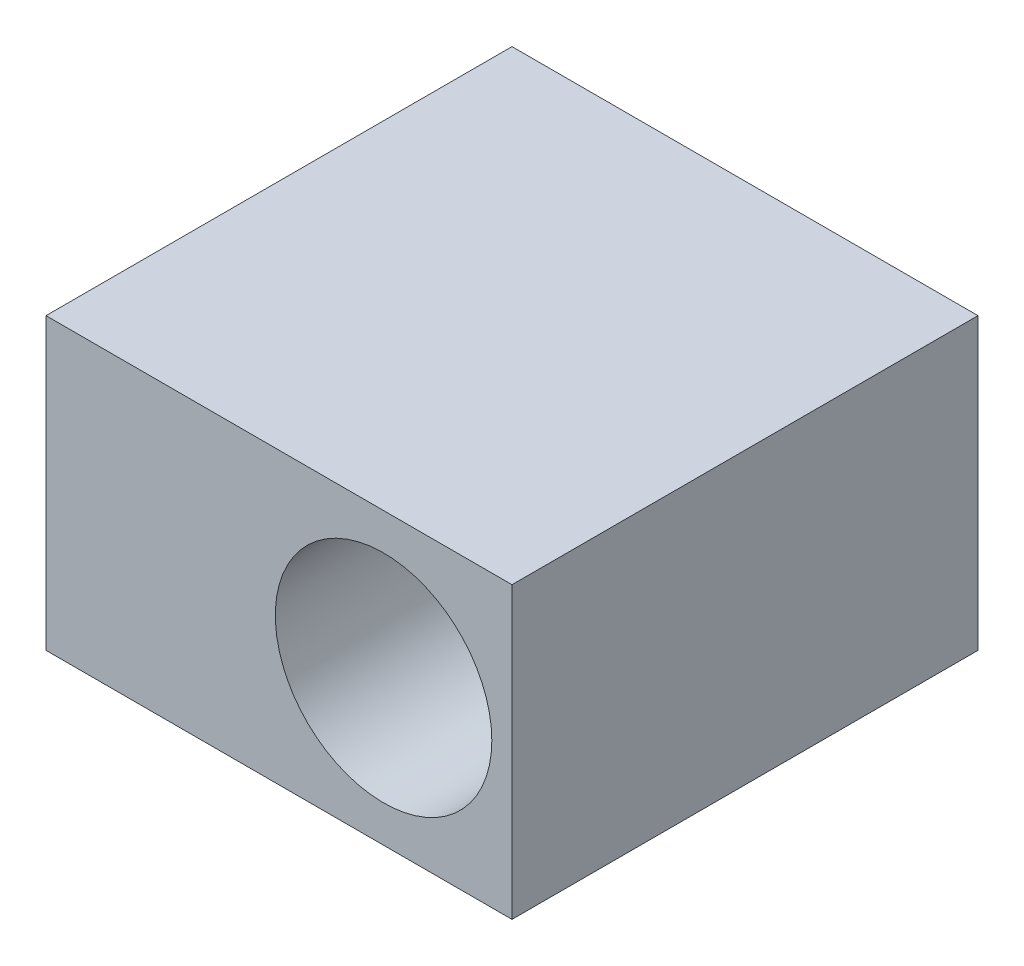
ISO-10303-21;
HEADER;
FILE_DESCRIPTION(('STEP AP214'),'2;1');
FILE_NAME('part.step','',(''),(''),'','','');
FILE_SCHEMA(('AUTOMOTIVE_DESIGN { 1 0 10303 214 1 1 1 1 }'));
ENDSEC;
DATA;
#1=APPLICATION_CONTEXT('core data for automotive mechanical design processes');
#2=APPLICATION_PROTOCOL_DEFINITION('international standard','automotive_design',2000,#1);
#3=PRODUCT_CONTEXT('',#1,'mechanical');
#4=PRODUCT('Part','Part','',(#3));
#5=PRODUCT_RELATED_PRODUCT_CATEGORY('part','',(#4));
#6=PRODUCT_DEFINITION_FORMATION('','',#4);
#7=PRODUCT_DEFINITION_CONTEXT('part definition',#1,'design');
#8=PRODUCT_DEFINITION('design','',#6,#7);
#9=PRODUCT_DEFINITION_SHAPE('','',#8);
#10=(LENGTH_UNIT() NAMED_UNIT(*) SI_UNIT(.MILLI.,.METRE.));
#11=(NAMED_UNIT(*) PLANE_ANGLE_UNIT() SI_UNIT($,.RADIAN.));
#12=(NAMED_UNIT(*) SI_UNIT($,.STERADIAN.) SOLID_ANGLE_UNIT());
#13=UNCERTAINTY_MEASURE_WITH_UNIT(LENGTH_MEASURE(1.E-05),#10,'distance_accuracy_value','');
#14=(GEOMETRIC_REPRESENTATION_CONTEXT(3) GLOBAL_UNCERTAINTY_ASSIGNED_CONTEXT((#13)) GLOBAL_UNIT_ASSIGNED_CONTEXT((#10,
#11,#12)) REPRESENTATION_CONTEXT('',''));
#15=CARTESIAN_POINT('',(0.,0.,0.));
#16=DIRECTION('',(0.,0.,1.));
#17=DIRECTION('',(1.,0.,0.));
#18=AXIS2_PLACEMENT_3D('',#15,#16,#17);
#19=CARTESIAN_POINT('',(0.,0.,0.));
#20=DIRECTION('',(0.,-1.,0.));
#21=DIRECTION('',(0.,0.,-1.));
#22=AXIS2_PLACEMENT_3D('',#19,#20,#21);
#23=PLANE('',#22);
#24=DIRECTION('',(0.,0.,-1.));
#25=VECTOR('',#24,1.);
#26=CARTESIAN_POINT('',(6.34999999999999,0.,6.34999999999999));
#27=LINE('',#26,#25);
#28=CARTESIAN_POINT('',(6.34999999999999,0.,6.34999999999999));
#29=VERTEX_POINT('',#28);
#30=CARTESIAN_POINT('',(6.34999999999999,0.,-6.35000000000001));
#31=VERTEX_POINT('',#30);
#32=EDGE_CURVE('E101',#29,#31,#27,.T.);
#33=ORIENTED_EDGE('',*,*,#32,.F.);
#34=DIRECTION('',(1.,0.,0.));
#35=VECTOR('',#34,1.);
#36=CARTESIAN_POINT('',(-6.35,0.,6.34999999999999));
#37=LINE('',#36,#35);
#38=CARTESIAN_POINT('',(-6.35,0.,6.34999999999999));
#39=VERTEX_POINT('',#38);
#40=EDGE_CURVE('E73',#39,#29,#37,.T.);
#41=ORIENTED_EDGE('',*,*,#40,.F.);
#42=DIRECTION('',(0.,0.,1.));
#43=VECTOR('',#42,1.);
#44=CARTESIAN_POINT('',(-6.35,0.,6.34999999999999));
#45=LINE('',#44,#43);
#46=CARTESIAN_POINT('',(-6.35,0.,-6.35000000000001));
#47=VERTEX_POINT('',#46);
#48=EDGE_CURVE('E67',#47,#39,#45,.T.);
#49=ORIENTED_EDGE('',*,*,#48,.F.);
#50=DIRECTION('',(-1.,0.,0.));
#51=VECTOR('',#50,1.);
#52=CARTESIAN_POINT('',(-6.35,0.,-6.35000000000001));
#53=LINE('',#52,#51);
#54=EDGE_CURVE('E91',#31,#47,#53,.T.);
#55=ORIENTED_EDGE('',*,*,#54,.F.);
#56=EDGE_LOOP('',(#33,#41,#49,#55));
#57=FACE_BOUND('',#56,.T.);
#58=CARTESIAN_POINT('',(-2.65,0.,0.));
#59=DIRECTION('',(0.,-1.,0.));
#60=DIRECTION('',(0.,0.,-1.));
#61=AXIS2_PLACEMENT_3D('',#58,#59,#60);
#62=CIRCLE('',#61,3.64999999999999);
#63=CARTESIAN_POINT('',(-2.65,0.,-3.64999999999999));
#64=VERTEX_POINT('',#63);
#65=EDGE_CURVE('E159',#64,#64,#62,.T.);
#66=ORIENTED_EDGE('',*,*,#65,.F.);
#67=EDGE_LOOP('',(#66));
#68=FACE_BOUND('',#67,.T.);
#69=ADVANCED_FACE('F33',(#57,#68),#23,.T.);
#70=CARTESIAN_POINT('',(6.34999999999999,7.9,6.34999999999999));
#71=DIRECTION('',(-1.,0.,0.));
#72=DIRECTION('',(0.,0.,1.));
#73=AXIS2_PLACEMENT_3D('',#70,#71,#72);
#74=PLANE('',#73);
#75=ORIENTED_EDGE('',*,*,#32,.T.);
#76=DIRECTION('',(0.,-1.,0.));
#77=VECTOR('',#76,1.);
#78=CARTESIAN_POINT('',(6.34999999999999,7.9,-6.35000000000001));
#79=LINE('',#78,#77);
#80=CARTESIAN_POINT('',(6.34999999999999,7.9,-6.35000000000001));
#81=VERTEX_POINT('',#80);
#82=EDGE_CURVE('E92',#81,#31,#79,.T.);
#83=ORIENTED_EDGE('',*,*,#82,.F.);
#84=DIRECTION('',(0.,0.,-1.));
#85=VECTOR('',#84,1.);
#86=CARTESIAN_POINT('',(6.34999999999999,7.9,6.34999999999999));
#87=LINE('',#86,#85);
#88=CARTESIAN_POINT('',(6.34999999999999,7.9,6.34999999999999));
#89=VERTEX_POINT('',#88);
#90=EDGE_CURVE('E86',#89,#81,#87,.T.);
#91=ORIENTED_EDGE('',*,*,#90,.F.);
#92=DIRECTION('',(0.,-1.,0.));
#93=VECTOR('',#92,1.);
#94=CARTESIAN_POINT('',(6.34999999999999,7.9,6.34999999999999));
#95=LINE('',#94,#93);
#96=EDGE_CURVE('E97',#89,#29,#95,.T.);
#97=ORIENTED_EDGE('',*,*,#96,.T.);
#98=EDGE_LOOP('',(#75,#83,#91,#97));
#99=FACE_BOUND('',#98,.T.);
#100=ADVANCED_FACE('F129',(#99),#74,.F.);
#101=CARTESIAN_POINT('',(-6.35,7.9,-6.35000000000001));
#102=DIRECTION('',(0.,0.,1.));
#103=DIRECTION('',(1.,0.,0.));
#104=AXIS2_PLACEMENT_3D('',#101,#102,#103);
#105=PLANE('',#104);
#106=CARTESIAN_POINT('',(2.84999999999999,3.95,-6.35000000000001));
#107=DIRECTION('',(0.,0.,1.));
#108=DIRECTION('',(1.,0.,0.));
#109=AXIS2_PLACEMENT_3D('',#106,#107,#108);
#110=CIRCLE('',#109,2.95);
#111=CARTESIAN_POINT('',(5.79999999999999,3.95,-6.35000000000001));
#112=VERTEX_POINT('',#111);
#113=EDGE_CURVE('E104',#112,#112,#110,.T.);
#114=ORIENTED_EDGE('',*,*,#113,.T.);
#115=EDGE_LOOP('',(#114));
#116=FACE_BOUND('',#115,.T.);
#117=ORIENTED_EDGE('',*,*,#54,.T.);
#118=DIRECTION('',(0.,-1.,0.));
#119=VECTOR('',#118,1.);
#120=CARTESIAN_POINT('',(-6.35,7.9,-6.35000000000001));
#121=LINE('',#120,#119);
#122=CARTESIAN_POINT('',(-6.35,7.9,-6.35000000000001));
#123=VERTEX_POINT('',#122);
#124=EDGE_CURVE('E89',#123,#47,#121,.T.);
#125=ORIENTED_EDGE('',*,*,#124,.F.);
#126=DIRECTION('',(-1.,0.,0.));
#127=VECTOR('',#126,1.);
#128=CARTESIAN_POINT('',(-6.35,7.9,-6.35000000000001));
#129=LINE('',#128,#127);
#130=EDGE_CURVE('E81',#81,#123,#129,.T.);
#131=ORIENTED_EDGE('',*,*,#130,.F.);
#132=ORIENTED_EDGE('',*,*,#82,.T.);
#133=EDGE_LOOP('',(#117,#125,#131,#132));
#134=FACE_BOUND('',#133,.T.);
#135=ADVANCED_FACE('F90',(#116,#134),#105,.F.);
#136=CARTESIAN_POINT('',(-6.35,7.9,6.34999999999999));
#137=DIRECTION('',(1.,0.,0.));
#138=DIRECTION('',(0.,0.,-1.));
#139=AXIS2_PLACEMENT_3D('',#136,#137,#138);
#140=PLANE('',#139);
#141=CARTESIAN_POINT('',(-6.35,3.95,-5.22500000000001));
#142=DIRECTION('',(-1.,0.,0.));
#143=DIRECTION('',(0.,0.,1.));
#144=AXIS2_PLACEMENT_3D('',#141,#142,#143);
#145=CIRCLE('',#144,1.05);
#146=CARTESIAN_POINT('',(-6.35,3.95,-4.17500000000001));
#147=VERTEX_POINT('',#146);
#148=EDGE_CURVE('E165',#147,#147,#145,.T.);
#149=ORIENTED_EDGE('',*,*,#148,.F.);
#150=EDGE_LOOP('',(#149));
#151=FACE_BOUND('',#150,.T.);
#152=ORIENTED_EDGE('',*,*,#48,.T.);
#153=DIRECTION('',(0.,-1.,0.));
#154=VECTOR('',#153,1.);
#155=CARTESIAN_POINT('',(-6.35,7.9,6.34999999999999));
#156=LINE('',#155,#154);
#157=CARTESIAN_POINT('',(-6.35,7.9,6.34999999999999));
#158=VERTEX_POINT('',#157);
#159=EDGE_CURVE('E93',#158,#39,#156,.T.);
#160=ORIENTED_EDGE('',*,*,#159,.F.);
#161=DIRECTION('',(0.,0.,1.));
#162=VECTOR('',#161,1.);
#163=CARTESIAN_POINT('',(-6.35,7.9,6.34999999999999));
#164=LINE('',#163,#162);
#165=EDGE_CURVE('E84',#123,#158,#164,.T.);
#166=ORIENTED_EDGE('',*,*,#165,.F.);
#167=ORIENTED_EDGE('',*,*,#124,.T.);
#168=EDGE_LOOP('',(#152,#160,#166,#167));
#169=FACE_BOUND('',#168,.T.);
#170=ADVANCED_FACE('F95',(#151,#169),#140,.F.);
#171=CARTESIAN_POINT('',(-6.35,7.9,6.34999999999999));
#172=DIRECTION('',(0.,0.,-1.));
#173=DIRECTION('',(-1.,0.,0.));
#174=AXIS2_PLACEMENT_3D('',#171,#172,#173);
#175=PLANE('',#174);
#176=CARTESIAN_POINT('',(2.84999999999999,3.95,6.34999999999999));
#177=DIRECTION('',(0.,0.,1.));
#178=DIRECTION('',(1.,0.,0.));
#179=AXIS2_PLACEMENT_3D('',#176,#177,#178);
#180=CIRCLE('',#179,2.95);
#181=CARTESIAN_POINT('',(5.79999999999999,3.95,6.34999999999999));
#182=VERTEX_POINT('',#181);
#183=EDGE_CURVE('E156',#182,#182,#180,.T.);
#184=ORIENTED_EDGE('',*,*,#183,.F.);
#185=EDGE_LOOP('',(#184));
#186=FACE_BOUND('',#185,.T.);
#187=ORIENTED_EDGE('',*,*,#40,.T.);
#188=ORIENTED_EDGE('',*,*,#96,.F.);
#189=DIRECTION('',(1.,0.,0.));
#190=VECTOR('',#189,1.);
#191=CARTESIAN_POINT('',(-6.35,7.9,6.34999999999999));
#192=LINE('',#191,#190);
#193=EDGE_CURVE('E50',#158,#89,#192,.T.);
#194=ORIENTED_EDGE('',*,*,#193,.F.);
#195=ORIENTED_EDGE('',*,*,#159,.T.);
#196=EDGE_LOOP('',(#187,#188,#194,#195));
#197=FACE_BOUND('',#196,.T.);
#198=ADVANCED_FACE('F141',(#186,#197),#175,.F.);
#199=CARTESIAN_POINT('',(0.,7.9,0.));
#200=DIRECTION('',(0.,-1.,0.));
#201=DIRECTION('',(0.,0.,-1.));
#202=AXIS2_PLACEMENT_3D('',#199,#200,#201);
#203=PLANE('',#202);
#204=ORIENTED_EDGE('',*,*,#90,.T.);
#205=ORIENTED_EDGE('',*,*,#130,.T.);
#206=ORIENTED_EDGE('',*,*,#165,.T.);
#207=ORIENTED_EDGE('',*,*,#193,.T.);
#208=EDGE_LOOP('',(#204,#205,#206,#207));
#209=FACE_BOUND('',#208,.T.);
#210=ADVANCED_FACE('F82',(#209),#203,.F.);
#211=CARTESIAN_POINT('',(2.84999999999999,3.95,-6.35000000000001));
#212=DIRECTION('',(0.,0.,1.));
#213=DIRECTION('',(1.,0.,0.));
#214=AXIS2_PLACEMENT_3D('',#211,#212,#213);
#215=CYLINDRICAL_SURFACE('',#214,2.95);
#216=ORIENTED_EDGE('',*,*,#113,.F.);
#217=EDGE_LOOP('',(#216));
#218=FACE_BOUND('',#217,.T.);
#219=ORIENTED_EDGE('',*,*,#183,.T.);
#220=EDGE_LOOP('',(#219));
#221=FACE_BOUND('',#220,.T.);
#222=ADVANCED_FACE('F179',(#218,#221),#215,.F.);
#223=CARTESIAN_POINT('',(-2.65,-3.1,0.));
#224=DIRECTION('',(0.,1.,0.));
#225=DIRECTION('',(0.,0.,1.));
#226=AXIS2_PLACEMENT_3D('',#223,#224,#225);
#227=CYLINDRICAL_SURFACE('',#226,3.64999999999999);
#228=CARTESIAN_POINT('',(-2.65,-1.29999999999999,0.));
#229=DIRECTION('',(0.,-1.,0.));
#230=DIRECTION('',(0.,0.,-1.));
#231=AXIS2_PLACEMENT_3D('',#228,#229,#230);
#232=CIRCLE('',#231,3.64999999999999);
#233=CARTESIAN_POINT('',(-2.65,-1.29999999999999,3.64999999999999));
#234=VERTEX_POINT('',#233);
#235=EDGE_CURVE('E11',#234,#234,#232,.F.);
#236=ORIENTED_EDGE('',*,*,#235,.T.);
#237=EDGE_LOOP('',(#236));
#238=FACE_BOUND('',#237,.T.);
#239=ORIENTED_EDGE('',*,*,#65,.T.);
#240=EDGE_LOOP('',(#239));
#241=FACE_BOUND('',#240,.T.);
#242=ADVANCED_FACE('F125',(#238,#241),#227,.T.);
#243=CARTESIAN_POINT('',(-2.65,-3.1,0.));
#244=DIRECTION('',(0.,-1.,0.));
#245=DIRECTION('',(0.,0.,-1.));
#246=AXIS2_PLACEMENT_3D('',#243,#244,#245);
#247=PLANE('',#246);
#248=CARTESIAN_POINT('',(-2.65,-3.1,0.));
#249=DIRECTION('',(0.,-1.,0.));
#250=DIRECTION('',(0.,0.,-1.));
#251=AXIS2_PLACEMENT_3D('',#248,#249,#250);
#252=CIRCLE('',#251,0.654296931769053);
#253=CARTESIAN_POINT('',(-2.65,-3.1,0.654296931769053));
#254=VERTEX_POINT('',#253);
#255=EDGE_CURVE('E42',#254,#254,#252,.T.);
#256=ORIENTED_EDGE('',*,*,#255,.T.);
#257=EDGE_LOOP('',(#256));
#258=FACE_BOUND('',#257,.T.);
#259=ADVANCED_FACE('F113',(#258),#247,.T.);
#260=CARTESIAN_POINT('',(-2.65,-3.1,0.));
#261=DIRECTION('',(0.,1.,0.));
#262=DIRECTION('',(0.,0.,1.));
#263=AXIS2_PLACEMENT_3D('',#260,#261,#262);
#264=CONICAL_SURFACE('',#263,0.654296931769053,1.02974425867665);
#265=CARTESIAN_POINT('',(-2.65,-1.29999999999999,3.64999999999999));
#266=CARTESIAN_POINT('',(-2.65,-1.31874999999999,3.61879475970591));
#267=CARTESIAN_POINT('',(-2.65,-1.33749999999999,3.58758951941184));
#268=CARTESIAN_POINT('',(-2.65,-1.37499999999999,3.5251790388237));
#269=CARTESIAN_POINT('',(-2.65,-1.39374999999999,3.49397379852963));
#270=CARTESIAN_POINT('',(-2.65,-1.43124999999999,3.43156331794148));
#271=CARTESIAN_POINT('',(-2.65,-1.44999999999999,3.40035807764741));
#272=CARTESIAN_POINT('',(-2.65,-1.48749999999999,3.33794759705926));
#273=CARTESIAN_POINT('',(-2.65,-1.50624999999999,3.30674235676519));
#274=CARTESIAN_POINT('',(-2.65,-1.54374999999999,3.24433187617705));
#275=CARTESIAN_POINT('',(-2.65,-1.56249999999999,3.21312663588298));
#276=CARTESIAN_POINT('',(-2.65,-1.59999999999999,3.15071615529483));
#277=CARTESIAN_POINT('',(-2.65,-1.61874999999999,3.11951091500076));
#278=CARTESIAN_POINT('',(-2.65,-1.65624999999999,3.05710043441261));
#279=CARTESIAN_POINT('',(-2.65,-1.67499999999999,3.02589519411854));
#280=CARTESIAN_POINT('',(-2.65,-1.71249999999999,2.9634847135304));
#281=CARTESIAN_POINT('',(-2.65,-1.73124999999999,2.93227947323633));
#282=CARTESIAN_POINT('',(-2.65,-1.76874999999999,2.86986899264818));
#283=CARTESIAN_POINT('',(-2.65,-1.78749999999999,2.83866375235411));
#284=CARTESIAN_POINT('',(-2.65,-1.82499999999999,2.77625327176596));
#285=CARTESIAN_POINT('',(-2.65,-1.84374999999999,2.74504803147189));
#286=CARTESIAN_POINT('',(-2.65,-1.88124999999999,2.68263755088375));
#287=CARTESIAN_POINT('',(-2.65,-1.89999999999999,2.65143231058968));
#288=CARTESIAN_POINT('',(-2.65,-1.93749999999999,2.58902183000153));
#289=CARTESIAN_POINT('',(-2.65,-1.95624999999999,2.55781658970746));
#290=CARTESIAN_POINT('',(-2.65,-1.99374999999999,2.49540610911931));
#291=CARTESIAN_POINT('',(-2.65,-2.01249999999999,2.46420086882524));
#292=CARTESIAN_POINT('',(-2.65,-2.04999999999999,2.4017903882371));
#293=CARTESIAN_POINT('',(-2.65,-2.06874999999999,2.37058514794303));
#294=CARTESIAN_POINT('',(-2.65,-2.10624999999999,2.30817466735488));
#295=CARTESIAN_POINT('',(-2.65,-2.12499999999999,2.27696942706081));
#296=CARTESIAN_POINT('',(-2.65,-2.16249999999999,2.21455894647266));
#297=CARTESIAN_POINT('',(-2.65,-2.18125,2.18335370617859));
#298=CARTESIAN_POINT('',(-2.65,-2.21875,2.12094322559045));
#299=CARTESIAN_POINT('',(-2.65,-2.23749999999999,2.08973798529638));
#300=CARTESIAN_POINT('',(-2.65,-2.275,2.02732750470823));
#301=CARTESIAN_POINT('',(-2.65,-2.29375,1.99612226441416));
#302=CARTESIAN_POINT('',(-2.65,-2.33125,1.93371178382601));
#303=CARTESIAN_POINT('',(-2.65,-2.35,1.90250654353194));
#304=CARTESIAN_POINT('',(-2.65,-2.3875,1.8400960629438));
#305=CARTESIAN_POINT('',(-2.65,-2.40625,1.80889082264973));
#306=CARTESIAN_POINT('',(-2.65,-2.44375,1.74648034206158));
#307=CARTESIAN_POINT('',(-2.65,-2.4625,1.71527510176751));
#308=CARTESIAN_POINT('',(-2.65,-2.5,1.65286462117936));
#309=CARTESIAN_POINT('',(-2.65,-2.51875,1.62165938088529));
#310=CARTESIAN_POINT('',(-2.65,-2.55625,1.55924890029715));
#311=CARTESIAN_POINT('',(-2.65,-2.575,1.52804366000308));
#312=CARTESIAN_POINT('',(-2.65,-2.6125,1.46563317941493));
#313=CARTESIAN_POINT('',(-2.65,-2.63125,1.43442793912086));
#314=CARTESIAN_POINT('',(-2.65,-2.66875,1.37201745853271));
#315=CARTESIAN_POINT('',(-2.65,-2.6875,1.34081221823864));
#316=CARTESIAN_POINT('',(-2.65,-2.725,1.2784017376505));
#317=CARTESIAN_POINT('',(-2.65,-2.74375,1.24719649735643));
#318=CARTESIAN_POINT('',(-2.65,-2.78125,1.18478601676828));
#319=CARTESIAN_POINT('',(-2.65,-2.8,1.15358077647421));
#320=CARTESIAN_POINT('',(-2.65,-2.8375,1.09117029588606));
#321=CARTESIAN_POINT('',(-2.65,-2.85625,1.05996505559199));
#322=CARTESIAN_POINT('',(-2.65,-2.89375,0.997554575003848));
#323=CARTESIAN_POINT('',(-2.65,-2.9125,0.966349334709775));
#324=CARTESIAN_POINT('',(-2.65,-2.95,0.903938854121631));
#325=CARTESIAN_POINT('',(-2.65,-2.96875,0.872733613827559));
#326=CARTESIAN_POINT('',(-2.65,-3.00625,0.810323133239415));
#327=CARTESIAN_POINT('',(-2.65,-3.025,0.779117892945342));
#328=CARTESIAN_POINT('',(-2.65,-3.0625,0.716707412357198));
#329=CARTESIAN_POINT('',(-2.65,-3.08125,0.685502172063125));
#330=CARTESIAN_POINT('',(-2.65,-3.1,0.654296931769053));
#331=B_SPLINE_CURVE_WITH_KNOTS('',3,(#265,#266,#267,#268,#269,#270,#271,#272,#273,#274,#275,
#276,#277,#278,#279,#280,#281,#282,#283,#284,#285,#286,#287,#288,#289,#290,#291,#292,#293,#294,
#295,#296,#297,#298,#299,#300,#301,#302,#303,#304,#305,#306,#307,#308,#309,#310,#311,#312,#313,
#314,#315,#316,#317,#318,#319,#320,#321,#322,#323,#324,#325,#326,#327,#328,#329,#330),
.UNSPECIFIED.,.F.,.F.,(4,2,2,2,2,2,2,2,2,2,2,2,2,2,2,2,2,2,2,2,2,2,2,2,2,2,2,2,2,2,2,2,4),(0.,
0.109215226485583,0.218430452971166,0.327645679456748,0.436860905942331,0.546076132427914,
0.655291358913497,0.764506585399079,0.873721811884662,0.982937038370245,1.09215226485583,
1.20136749134141,1.31058271782699,1.41979794431257,1.52901317079816,1.63822839728374,
1.74744362376932,1.85665885025491,1.96587407674049,2.07508930322607,2.18430452971165,
2.29351975619724,2.40273498268282,2.5119502091684,2.62116543565398,2.73038066213957,
2.83959588862515,2.94881111511073,3.05802634159632,3.1672415680819,3.27645679456748,
3.38567202105306,3.49488724753865),.UNSPECIFIED.);
#332=EDGE_CURVE('BSEAM35',#234,#254,#331,.T.);
#333=ORIENTED_EDGE('',*,*,#235,.F.);
#334=ORIENTED_EDGE('',*,*,#255,.F.);
#335=ORIENTED_EDGE('',*,*,#332,.T.);
#336=ORIENTED_EDGE('',*,*,#332,.F.);
#337=EDGE_LOOP('',(#333,#335,#334,#336));
#338=FACE_BOUND('',#337,.T.);
#339=ADVANCED_FACE('F35',(#338),#264,.T.);
#340=CARTESIAN_POINT('',(-2.35,3.95,-5.22500000000001));
#341=DIRECTION('',(-1.,0.,0.));
#342=DIRECTION('',(0.,0.,1.));
#343=AXIS2_PLACEMENT_3D('',#340,#341,#342);
#344=CYLINDRICAL_SURFACE('',#343,1.05);
#345=CARTESIAN_POINT('',(-2.35,3.95,-5.22500000000001));
#346=DIRECTION('',(-1.,0.,0.));
#347=DIRECTION('',(0.,0.,1.));
#348=AXIS2_PLACEMENT_3D('',#345,#346,#347);
#349=CIRCLE('',#348,1.05);
#350=CARTESIAN_POINT('',(-2.35,3.95,-4.17500000000001));
#351=VERTEX_POINT('',#350);
#352=EDGE_CURVE('E164',#351,#351,#349,.T.);
#353=ORIENTED_EDGE('',*,*,#352,.F.);
#354=EDGE_LOOP('',(#353));
#355=FACE_BOUND('',#354,.T.);
#356=ORIENTED_EDGE('',*,*,#148,.T.);
#357=EDGE_LOOP('',(#356));
#358=FACE_BOUND('',#357,.T.);
#359=ADVANCED_FACE('F116',(#355,#358),#344,.F.);
#360=CARTESIAN_POINT('',(-2.35,3.95,-5.22500000000001));
#361=DIRECTION('',(-1.,0.,0.));
#362=DIRECTION('',(0.,0.,1.));
#363=AXIS2_PLACEMENT_3D('',#360,#361,#362);
#364=PLANE('',#363);
#365=ORIENTED_EDGE('',*,*,#352,.T.);
#366=EDGE_LOOP('',(#365));
#367=FACE_BOUND('',#366,.T.);
#368=ADVANCED_FACE('F122',(#367),#364,.T.);
#369=CLOSED_SHELL('',(#69,#100,#135,#170,#198,#210,#222,#242,#259,#339,#359,#368));
#370=MANIFOLD_SOLID_BREP('B2',#369);
#371=ADVANCED_BREP_SHAPE_REPRESENTATION('',(#18,#370),#14);
#372=SHAPE_DEFINITION_REPRESENTATION(#9,#371);
ENDSEC;
END-ISO-10303-21;
